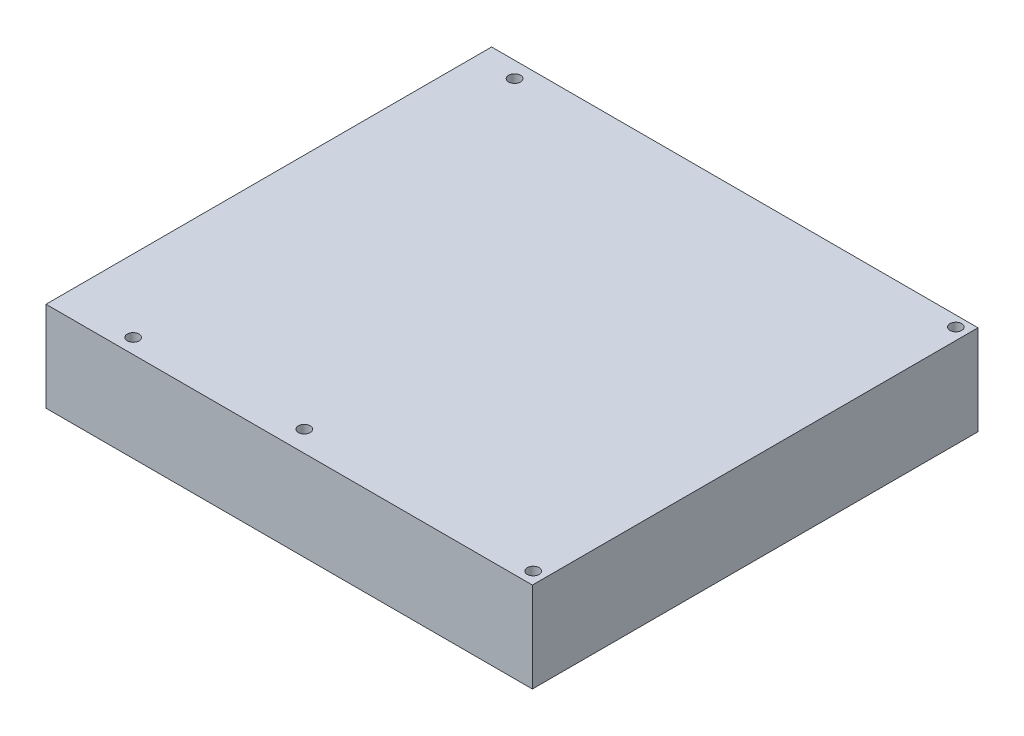
ISO-10303-21;
HEADER;
FILE_DESCRIPTION(('STEP AP214'),'2;1');
FILE_NAME('part.step','',(''),(''),'','','');
FILE_SCHEMA(('AUTOMOTIVE_DESIGN { 1 0 10303 214 1 1 1 1 }'));
ENDSEC;
DATA;
#1=APPLICATION_CONTEXT('core data for automotive mechanical design processes');
#2=APPLICATION_PROTOCOL_DEFINITION('international standard','automotive_design',2000,#1);
#3=PRODUCT_CONTEXT('',#1,'mechanical');
#4=PRODUCT('Part','Part','',(#3));
#5=PRODUCT_RELATED_PRODUCT_CATEGORY('part','',(#4));
#6=PRODUCT_DEFINITION_FORMATION('','',#4);
#7=PRODUCT_DEFINITION_CONTEXT('part definition',#1,'design');
#8=PRODUCT_DEFINITION('design','',#6,#7);
#9=PRODUCT_DEFINITION_SHAPE('','',#8);
#10=(LENGTH_UNIT() NAMED_UNIT(*) SI_UNIT(.MILLI.,.METRE.));
#11=(NAMED_UNIT(*) PLANE_ANGLE_UNIT() SI_UNIT($,.RADIAN.));
#12=(NAMED_UNIT(*) SI_UNIT($,.STERADIAN.) SOLID_ANGLE_UNIT());
#13=UNCERTAINTY_MEASURE_WITH_UNIT(LENGTH_MEASURE(1.E-05),#10,'distance_accuracy_value','');
#14=(GEOMETRIC_REPRESENTATION_CONTEXT(3) GLOBAL_UNCERTAINTY_ASSIGNED_CONTEXT((#13)) GLOBAL_UNIT_ASSIGNED_CONTEXT((#10,
#11,#12)) REPRESENTATION_CONTEXT('',''));
#15=CARTESIAN_POINT('',(0.,0.,0.));
#16=DIRECTION('',(0.,0.,1.));
#17=DIRECTION('',(1.,0.,0.));
#18=AXIS2_PLACEMENT_3D('',#15,#16,#17);
#19=CARTESIAN_POINT('',(0.,19.,0.));
#20=DIRECTION('',(1.,0.,0.));
#21=DIRECTION('',(0.,0.,-1.));
#22=AXIS2_PLACEMENT_3D('',#19,#20,#21);
#23=PLANE('',#22);
#24=DIRECTION('',(0.,0.,1.));
#25=VECTOR('',#24,1.);
#26=CARTESIAN_POINT('',(0.,0.,0.));
#27=LINE('',#26,#25);
#28=CARTESIAN_POINT('',(0.,0.,-94.));
#29=VERTEX_POINT('',#28);
#30=CARTESIAN_POINT('',(0.,0.,0.));
#31=VERTEX_POINT('',#30);
#32=EDGE_CURVE('E97',#29,#31,#27,.T.);
#33=ORIENTED_EDGE('',*,*,#32,.T.);
#34=DIRECTION('',(0.,-1.,0.));
#35=VECTOR('',#34,1.);
#36=CARTESIAN_POINT('',(0.,19.,0.));
#37=LINE('',#36,#35);
#38=CARTESIAN_POINT('',(0.,19.,0.));
#39=VERTEX_POINT('',#38);
#40=EDGE_CURVE('E11',#39,#31,#37,.T.);
#41=ORIENTED_EDGE('',*,*,#40,.F.);
#42=DIRECTION('',(0.,0.,1.));
#43=VECTOR('',#42,1.);
#44=CARTESIAN_POINT('',(0.,19.,0.));
#45=LINE('',#44,#43);
#46=CARTESIAN_POINT('',(0.,19.,-94.));
#47=VERTEX_POINT('',#46);
#48=EDGE_CURVE('E85',#47,#39,#45,.T.);
#49=ORIENTED_EDGE('',*,*,#48,.F.);
#50=DIRECTION('',(0.,-1.,0.));
#51=VECTOR('',#50,1.);
#52=CARTESIAN_POINT('',(0.,19.,-94.));
#53=LINE('',#52,#51);
#54=EDGE_CURVE('E93',#47,#29,#53,.T.);
#55=ORIENTED_EDGE('',*,*,#54,.T.);
#56=EDGE_LOOP('',(#33,#41,#49,#55));
#57=FACE_BOUND('',#56,.T.);
#58=ADVANCED_FACE('F34',(#57),#23,.F.);
#59=CARTESIAN_POINT('',(0.,19.,0.));
#60=DIRECTION('',(0.,0.,-1.));
#61=DIRECTION('',(-1.,0.,0.));
#62=AXIS2_PLACEMENT_3D('',#59,#60,#61);
#63=PLANE('',#62);
#64=DIRECTION('',(1.,0.,0.));
#65=VECTOR('',#64,1.);
#66=CARTESIAN_POINT('',(0.,0.,0.));
#67=LINE('',#66,#65);
#68=CARTESIAN_POINT('',(102.6,0.,0.));
#69=VERTEX_POINT('',#68);
#70=EDGE_CURVE('E89',#31,#69,#67,.T.);
#71=ORIENTED_EDGE('',*,*,#70,.T.);
#72=DIRECTION('',(0.,-1.,0.));
#73=VECTOR('',#72,1.);
#74=CARTESIAN_POINT('',(102.6,19.,0.));
#75=LINE('',#74,#73);
#76=CARTESIAN_POINT('',(102.6,19.,0.));
#77=VERTEX_POINT('',#76);
#78=EDGE_CURVE('E42',#77,#69,#75,.T.);
#79=ORIENTED_EDGE('',*,*,#78,.F.);
#80=DIRECTION('',(1.,0.,0.));
#81=VECTOR('',#80,1.);
#82=CARTESIAN_POINT('',(0.,19.,0.));
#83=LINE('',#82,#81);
#84=EDGE_CURVE('E80',#39,#77,#83,.T.);
#85=ORIENTED_EDGE('',*,*,#84,.F.);
#86=ORIENTED_EDGE('',*,*,#40,.T.);
#87=EDGE_LOOP('',(#71,#79,#85,#86));
#88=FACE_BOUND('',#87,.T.);
#89=ADVANCED_FACE('F88',(#88),#63,.F.);
#90=CARTESIAN_POINT('',(102.6,19.,0.));
#91=DIRECTION('',(-1.,0.,0.));
#92=DIRECTION('',(0.,0.,1.));
#93=AXIS2_PLACEMENT_3D('',#90,#91,#92);
#94=PLANE('',#93);
#95=DIRECTION('',(0.,0.,-1.));
#96=VECTOR('',#95,1.);
#97=CARTESIAN_POINT('',(102.6,0.,0.));
#98=LINE('',#97,#96);
#99=CARTESIAN_POINT('',(102.6,0.,-94.));
#100=VERTEX_POINT('',#99);
#101=EDGE_CURVE('E67',#69,#100,#98,.T.);
#102=ORIENTED_EDGE('',*,*,#101,.T.);
#103=DIRECTION('',(0.,-1.,0.));
#104=VECTOR('',#103,1.);
#105=CARTESIAN_POINT('',(102.6,19.,-94.));
#106=LINE('',#105,#104);
#107=CARTESIAN_POINT('',(102.6,19.,-94.));
#108=VERTEX_POINT('',#107);
#109=EDGE_CURVE('E90',#108,#100,#106,.T.);
#110=ORIENTED_EDGE('',*,*,#109,.F.);
#111=DIRECTION('',(0.,0.,-1.));
#112=VECTOR('',#111,1.);
#113=CARTESIAN_POINT('',(102.6,19.,0.));
#114=LINE('',#113,#112);
#115=EDGE_CURVE('E83',#77,#108,#114,.T.);
#116=ORIENTED_EDGE('',*,*,#115,.F.);
#117=ORIENTED_EDGE('',*,*,#78,.T.);
#118=EDGE_LOOP('',(#102,#110,#116,#117));
#119=FACE_BOUND('',#118,.T.);
#120=ADVANCED_FACE('F91',(#119),#94,.F.);
#121=CARTESIAN_POINT('',(0.,19.,-94.));
#122=DIRECTION('',(0.,0.,1.));
#123=DIRECTION('',(1.,0.,0.));
#124=AXIS2_PLACEMENT_3D('',#121,#122,#123);
#125=PLANE('',#124);
#126=DIRECTION('',(-1.,0.,0.));
#127=VECTOR('',#126,1.);
#128=CARTESIAN_POINT('',(0.,0.,-94.));
#129=LINE('',#128,#127);
#130=EDGE_CURVE('E73',#100,#29,#129,.T.);
#131=ORIENTED_EDGE('',*,*,#130,.T.);
#132=ORIENTED_EDGE('',*,*,#54,.F.);
#133=DIRECTION('',(-1.,0.,0.));
#134=VECTOR('',#133,1.);
#135=CARTESIAN_POINT('',(0.,19.,-94.));
#136=LINE('',#135,#134);
#137=EDGE_CURVE('E50',#108,#47,#136,.T.);
#138=ORIENTED_EDGE('',*,*,#137,.F.);
#139=ORIENTED_EDGE('',*,*,#109,.T.);
#140=EDGE_LOOP('',(#131,#132,#138,#139));
#141=FACE_BOUND('',#140,.T.);
#142=ADVANCED_FACE('F105',(#141),#125,.F.);
#143=CARTESIAN_POINT('',(0.,19.,0.));
#144=DIRECTION('',(0.,-1.,0.));
#145=DIRECTION('',(0.,0.,-1.));
#146=AXIS2_PLACEMENT_3D('',#143,#144,#145);
#147=PLANE('',#146);
#148=CARTESIAN_POINT('',(15.2590178186932,19.,-3.12211071743536));
#149=DIRECTION('',(0.,1.,0.));
#150=DIRECTION('',(0.,0.,1.));
#151=AXIS2_PLACEMENT_3D('',#148,#149,#150);
#152=CIRCLE('',#151,1.25);
#153=CARTESIAN_POINT('',(15.2590178186932,19.,-1.87211071743535));
#154=VERTEX_POINT('',#153);
#155=EDGE_CURVE('E135',#154,#154,#152,.T.);
#156=ORIENTED_EDGE('',*,*,#155,.F.);
#157=EDGE_LOOP('',(#156));
#158=FACE_BOUND('',#157,.T.);
#159=CARTESIAN_POINT('',(50.0634893604461,19.,-4.42206201110795));
#160=DIRECTION('',(0.,1.,0.));
#161=DIRECTION('',(0.,0.,1.));
#162=AXIS2_PLACEMENT_3D('',#159,#160,#161);
#163=CIRCLE('',#162,1.25);
#164=CARTESIAN_POINT('',(50.0634893604461,19.,-3.17206201110795));
#165=VERTEX_POINT('',#164);
#166=EDGE_CURVE('E129',#165,#165,#163,.T.);
#167=ORIENTED_EDGE('',*,*,#166,.F.);
#168=EDGE_LOOP('',(#167));
#169=FACE_BOUND('',#168,.T.);
#170=CARTESIAN_POINT('',(100.126132376127,19.,-2.64041858058614));
#171=DIRECTION('',(0.,1.,0.));
#172=DIRECTION('',(0.,0.,1.));
#173=AXIS2_PLACEMENT_3D('',#170,#171,#172);
#174=CIRCLE('',#173,1.25);
#175=CARTESIAN_POINT('',(100.126132376127,19.,-1.39041858058614));
#176=VERTEX_POINT('',#175);
#177=EDGE_CURVE('E123',#176,#176,#174,.T.);
#178=ORIENTED_EDGE('',*,*,#177,.F.);
#179=EDGE_LOOP('',(#178));
#180=FACE_BOUND('',#179,.T.);
#181=CARTESIAN_POINT('',(100.126132376127,19.,-91.7998948428918));
#182=DIRECTION('',(0.,1.,0.));
#183=DIRECTION('',(0.,0.,1.));
#184=AXIS2_PLACEMENT_3D('',#181,#182,#183);
#185=CIRCLE('',#184,1.25);
#186=CARTESIAN_POINT('',(100.126132376127,19.,-90.5498948428918));
#187=VERTEX_POINT('',#186);
#188=EDGE_CURVE('E117',#187,#187,#185,.T.);
#189=ORIENTED_EDGE('',*,*,#188,.F.);
#190=EDGE_LOOP('',(#189));
#191=FACE_BOUND('',#190,.T.);
#192=CARTESIAN_POINT('',(8.19879565030336,19.,-90.6381270742087));
#193=DIRECTION('',(0.,1.,0.));
#194=DIRECTION('',(0.,0.,1.));
#195=AXIS2_PLACEMENT_3D('',#192,#193,#194);
#196=CIRCLE('',#195,1.25);
#197=CARTESIAN_POINT('',(8.19879565030336,19.,-89.3881270742087));
#198=VERTEX_POINT('',#197);
#199=EDGE_CURVE('E111',#198,#198,#196,.T.);
#200=ORIENTED_EDGE('',*,*,#199,.F.);
#201=EDGE_LOOP('',(#200));
#202=FACE_BOUND('',#201,.T.);
#203=ORIENTED_EDGE('',*,*,#48,.T.);
#204=ORIENTED_EDGE('',*,*,#84,.T.);
#205=ORIENTED_EDGE('',*,*,#115,.T.);
#206=ORIENTED_EDGE('',*,*,#137,.T.);
#207=EDGE_LOOP('',(#203,#204,#205,#206));
#208=FACE_BOUND('',#207,.T.);
#209=ADVANCED_FACE('F81',(#158,#169,#180,#191,#202,#208),#147,.F.);
#210=CARTESIAN_POINT('',(0.,0.,0.));
#211=DIRECTION('',(0.,-1.,0.));
#212=DIRECTION('',(0.,0.,-1.));
#213=AXIS2_PLACEMENT_3D('',#210,#211,#212);
#214=PLANE('',#213);
#215=CARTESIAN_POINT('',(15.2590178186932,0.,-3.12211071743536));
#216=DIRECTION('',(0.,1.,0.));
#217=DIRECTION('',(0.,0.,1.));
#218=AXIS2_PLACEMENT_3D('',#215,#216,#217);
#219=CIRCLE('',#218,1.25);
#220=CARTESIAN_POINT('',(15.2590178186932,0.,-1.87211071743535));
#221=VERTEX_POINT('',#220);
#222=EDGE_CURVE('E132',#221,#221,#219,.T.);
#223=ORIENTED_EDGE('',*,*,#222,.T.);
#224=EDGE_LOOP('',(#223));
#225=FACE_BOUND('',#224,.T.);
#226=CARTESIAN_POINT('',(50.0634893604461,0.,-4.42206201110795));
#227=DIRECTION('',(0.,1.,0.));
#228=DIRECTION('',(0.,0.,1.));
#229=AXIS2_PLACEMENT_3D('',#226,#227,#228);
#230=CIRCLE('',#229,1.25);
#231=CARTESIAN_POINT('',(50.0634893604461,0.,-3.17206201110795));
#232=VERTEX_POINT('',#231);
#233=EDGE_CURVE('E126',#232,#232,#230,.T.);
#234=ORIENTED_EDGE('',*,*,#233,.T.);
#235=EDGE_LOOP('',(#234));
#236=FACE_BOUND('',#235,.T.);
#237=CARTESIAN_POINT('',(100.126132376127,0.,-2.64041858058614));
#238=DIRECTION('',(0.,1.,0.));
#239=DIRECTION('',(0.,0.,1.));
#240=AXIS2_PLACEMENT_3D('',#237,#238,#239);
#241=CIRCLE('',#240,1.25);
#242=CARTESIAN_POINT('',(100.126132376127,0.,-1.39041858058614));
#243=VERTEX_POINT('',#242);
#244=EDGE_CURVE('E120',#243,#243,#241,.T.);
#245=ORIENTED_EDGE('',*,*,#244,.T.);
#246=EDGE_LOOP('',(#245));
#247=FACE_BOUND('',#246,.T.);
#248=CARTESIAN_POINT('',(100.126132376127,0.,-91.7998948428918));
#249=DIRECTION('',(0.,1.,0.));
#250=DIRECTION('',(0.,0.,1.));
#251=AXIS2_PLACEMENT_3D('',#248,#249,#250);
#252=CIRCLE('',#251,1.25);
#253=CARTESIAN_POINT('',(100.126132376127,0.,-90.5498948428918));
#254=VERTEX_POINT('',#253);
#255=EDGE_CURVE('E114',#254,#254,#252,.T.);
#256=ORIENTED_EDGE('',*,*,#255,.T.);
#257=EDGE_LOOP('',(#256));
#258=FACE_BOUND('',#257,.T.);
#259=CARTESIAN_POINT('',(8.19879565030336,0.,-90.6381270742087));
#260=DIRECTION('',(0.,1.,0.));
#261=DIRECTION('',(0.,0.,1.));
#262=AXIS2_PLACEMENT_3D('',#259,#260,#261);
#263=CIRCLE('',#262,1.25);
#264=CARTESIAN_POINT('',(8.19879565030336,0.,-89.3881270742087));
#265=VERTEX_POINT('',#264);
#266=EDGE_CURVE('E100',#265,#265,#263,.T.);
#267=ORIENTED_EDGE('',*,*,#266,.T.);
#268=EDGE_LOOP('',(#267));
#269=FACE_BOUND('',#268,.T.);
#270=ORIENTED_EDGE('',*,*,#32,.F.);
#271=ORIENTED_EDGE('',*,*,#130,.F.);
#272=ORIENTED_EDGE('',*,*,#101,.F.);
#273=ORIENTED_EDGE('',*,*,#70,.F.);
#274=EDGE_LOOP('',(#270,#271,#272,#273));
#275=FACE_BOUND('',#274,.T.);
#276=ADVANCED_FACE('F108',(#225,#236,#247,#258,#269,#275),#214,.T.);
#277=CARTESIAN_POINT('',(8.19879565030336,0.,-90.6381270742087));
#278=DIRECTION('',(0.,1.,0.));
#279=DIRECTION('',(0.,0.,1.));
#280=AXIS2_PLACEMENT_3D('',#277,#278,#279);
#281=CYLINDRICAL_SURFACE('',#280,1.25);
#282=ORIENTED_EDGE('',*,*,#266,.F.);
#283=EDGE_LOOP('',(#282));
#284=FACE_BOUND('',#283,.T.);
#285=ORIENTED_EDGE('',*,*,#199,.T.);
#286=EDGE_LOOP('',(#285));
#287=FACE_BOUND('',#286,.T.);
#288=ADVANCED_FACE('F161',(#284,#287),#281,.F.);
#289=CARTESIAN_POINT('',(100.126132376127,0.,-91.7998948428918));
#290=DIRECTION('',(0.,1.,0.));
#291=DIRECTION('',(0.,0.,1.));
#292=AXIS2_PLACEMENT_3D('',#289,#290,#291);
#293=CYLINDRICAL_SURFACE('',#292,1.25);
#294=ORIENTED_EDGE('',*,*,#255,.F.);
#295=EDGE_LOOP('',(#294));
#296=FACE_BOUND('',#295,.T.);
#297=ORIENTED_EDGE('',*,*,#188,.T.);
#298=EDGE_LOOP('',(#297));
#299=FACE_BOUND('',#298,.T.);
#300=ADVANCED_FACE('F163',(#296,#299),#293,.F.);
#301=CARTESIAN_POINT('',(100.126132376127,0.,-2.64041858058614));
#302=DIRECTION('',(0.,1.,0.));
#303=DIRECTION('',(0.,0.,1.));
#304=AXIS2_PLACEMENT_3D('',#301,#302,#303);
#305=CYLINDRICAL_SURFACE('',#304,1.25);
#306=ORIENTED_EDGE('',*,*,#244,.F.);
#307=EDGE_LOOP('',(#306));
#308=FACE_BOUND('',#307,.T.);
#309=ORIENTED_EDGE('',*,*,#177,.T.);
#310=EDGE_LOOP('',(#309));
#311=FACE_BOUND('',#310,.T.);
#312=ADVANCED_FACE('F170',(#308,#311),#305,.F.);
#313=CARTESIAN_POINT('',(50.0634893604461,0.,-4.42206201110795));
#314=DIRECTION('',(0.,1.,0.));
#315=DIRECTION('',(0.,0.,1.));
#316=AXIS2_PLACEMENT_3D('',#313,#314,#315);
#317=CYLINDRICAL_SURFACE('',#316,1.25);
#318=ORIENTED_EDGE('',*,*,#233,.F.);
#319=EDGE_LOOP('',(#318));
#320=FACE_BOUND('',#319,.T.);
#321=ORIENTED_EDGE('',*,*,#166,.T.);
#322=EDGE_LOOP('',(#321));
#323=FACE_BOUND('',#322,.T.);
#324=ADVANCED_FACE('F146',(#320,#323),#317,.F.);
#325=CARTESIAN_POINT('',(15.2590178186932,0.,-3.12211071743536));
#326=DIRECTION('',(0.,1.,0.));
#327=DIRECTION('',(0.,0.,1.));
#328=AXIS2_PLACEMENT_3D('',#325,#326,#327);
#329=CYLINDRICAL_SURFACE('',#328,1.25);
#330=ORIENTED_EDGE('',*,*,#222,.F.);
#331=EDGE_LOOP('',(#330));
#332=FACE_BOUND('',#331,.T.);
#333=ORIENTED_EDGE('',*,*,#155,.T.);
#334=EDGE_LOOP('',(#333));
#335=FACE_BOUND('',#334,.T.);
#336=ADVANCED_FACE('F143',(#332,#335),#329,.F.);
#337=CLOSED_SHELL('',(#58,#89,#120,#142,#209,#276,#288,#300,#312,#324,#336));
#338=MANIFOLD_SOLID_BREP('B2',#337);
#339=ADVANCED_BREP_SHAPE_REPRESENTATION('',(#18,#338),#14);
#340=SHAPE_DEFINITION_REPRESENTATION(#9,#339);
ENDSEC;
END-ISO-10303-21;
